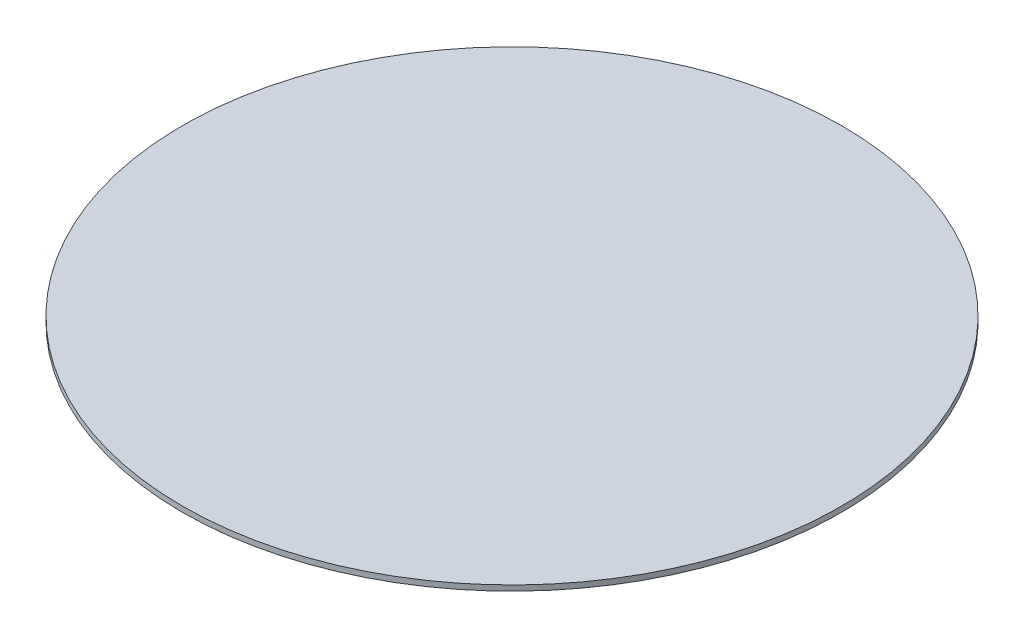
ISO-10303-21;
HEADER;
FILE_DESCRIPTION(('STEP AP214'),'2;1');
FILE_NAME('part.step','',(''),(''),'','','');
FILE_SCHEMA(('AUTOMOTIVE_DESIGN { 1 0 10303 214 1 1 1 1 }'));
ENDSEC;
DATA;
#1=APPLICATION_CONTEXT('core data for automotive mechanical design processes');
#2=APPLICATION_PROTOCOL_DEFINITION('international standard','automotive_design',2000,#1);
#3=PRODUCT_CONTEXT('',#1,'mechanical');
#4=PRODUCT('Part','Part','',(#3));
#5=PRODUCT_RELATED_PRODUCT_CATEGORY('part','',(#4));
#6=PRODUCT_DEFINITION_FORMATION('','',#4);
#7=PRODUCT_DEFINITION_CONTEXT('part definition',#1,'design');
#8=PRODUCT_DEFINITION('design','',#6,#7);
#9=PRODUCT_DEFINITION_SHAPE('','',#8);
#10=(LENGTH_UNIT() NAMED_UNIT(*) SI_UNIT(.MILLI.,.METRE.));
#11=(NAMED_UNIT(*) PLANE_ANGLE_UNIT() SI_UNIT($,.RADIAN.));
#12=(NAMED_UNIT(*) SI_UNIT($,.STERADIAN.) SOLID_ANGLE_UNIT());
#13=UNCERTAINTY_MEASURE_WITH_UNIT(LENGTH_MEASURE(1.E-05),#10,'distance_accuracy_value','');
#14=(GEOMETRIC_REPRESENTATION_CONTEXT(3) GLOBAL_UNCERTAINTY_ASSIGNED_CONTEXT((#13)) GLOBAL_UNIT_ASSIGNED_CONTEXT((#10,
#11,#12)) REPRESENTATION_CONTEXT('',''));
#15=CARTESIAN_POINT('',(0.,0.,0.));
#16=DIRECTION('',(0.,0.,1.));
#17=DIRECTION('',(1.,0.,0.));
#18=AXIS2_PLACEMENT_3D('',#15,#16,#17);
#19=CARTESIAN_POINT('',(0.,10.,0.));
#20=DIRECTION('',(0.,-1.,0.));
#21=DIRECTION('',(0.,0.,-1.));
#22=AXIS2_PLACEMENT_3D('',#19,#20,#21);
#23=CYLINDRICAL_SURFACE('',#22,609.6);
#24=CARTESIAN_POINT('',(0.,10.,0.));
#25=DIRECTION('',(0.,1.,0.));
#26=DIRECTION('',(0.,0.,1.));
#27=AXIS2_PLACEMENT_3D('',#24,#25,#26);
#28=CIRCLE('',#27,609.6);
#29=CARTESIAN_POINT('',(0.,10.,609.6));
#30=VERTEX_POINT('',#29);
#31=EDGE_CURVE('E10',#30,#30,#28,.T.);
#32=ORIENTED_EDGE('',*,*,#31,.F.);
#33=EDGE_LOOP('',(#32));
#34=FACE_BOUND('',#33,.T.);
#35=CARTESIAN_POINT('',(0.,0.,0.));
#36=DIRECTION('',(0.,1.,0.));
#37=DIRECTION('',(0.,0.,1.));
#38=AXIS2_PLACEMENT_3D('',#35,#36,#37);
#39=CIRCLE('',#38,609.6);
#40=CARTESIAN_POINT('',(0.,0.,609.6));
#41=VERTEX_POINT('',#40);
#42=EDGE_CURVE('E40',#41,#41,#39,.T.);
#43=ORIENTED_EDGE('',*,*,#42,.T.);
#44=EDGE_LOOP('',(#43));
#45=FACE_BOUND('',#44,.T.);
#46=ADVANCED_FACE('F37',(#34,#45),#23,.T.);
#47=CARTESIAN_POINT('',(0.,10.,0.));
#48=DIRECTION('',(0.,1.,0.));
#49=DIRECTION('',(0.,0.,1.));
#50=AXIS2_PLACEMENT_3D('',#47,#48,#49);
#51=PLANE('',#50);
#52=ORIENTED_EDGE('',*,*,#31,.T.);
#53=EDGE_LOOP('',(#52));
#54=FACE_BOUND('',#53,.T.);
#55=ADVANCED_FACE('F52',(#54),#51,.T.);
#56=CARTESIAN_POINT('',(0.,0.,0.));
#57=DIRECTION('',(0.,1.,0.));
#58=DIRECTION('',(0.,0.,1.));
#59=AXIS2_PLACEMENT_3D('',#56,#57,#58);
#60=PLANE('',#59);
#61=ORIENTED_EDGE('',*,*,#42,.F.);
#62=EDGE_LOOP('',(#61));
#63=FACE_BOUND('',#62,.T.);
#64=ADVANCED_FACE('F50',(#63),#60,.F.);
#65=CLOSED_SHELL('',(#46,#55,#64));
#66=MANIFOLD_SOLID_BREP('B2',#65);
#67=ADVANCED_BREP_SHAPE_REPRESENTATION('',(#18,#66),#14);
#68=SHAPE_DEFINITION_REPRESENTATION(#9,#67);
ENDSEC;
END-ISO-10303-21;
